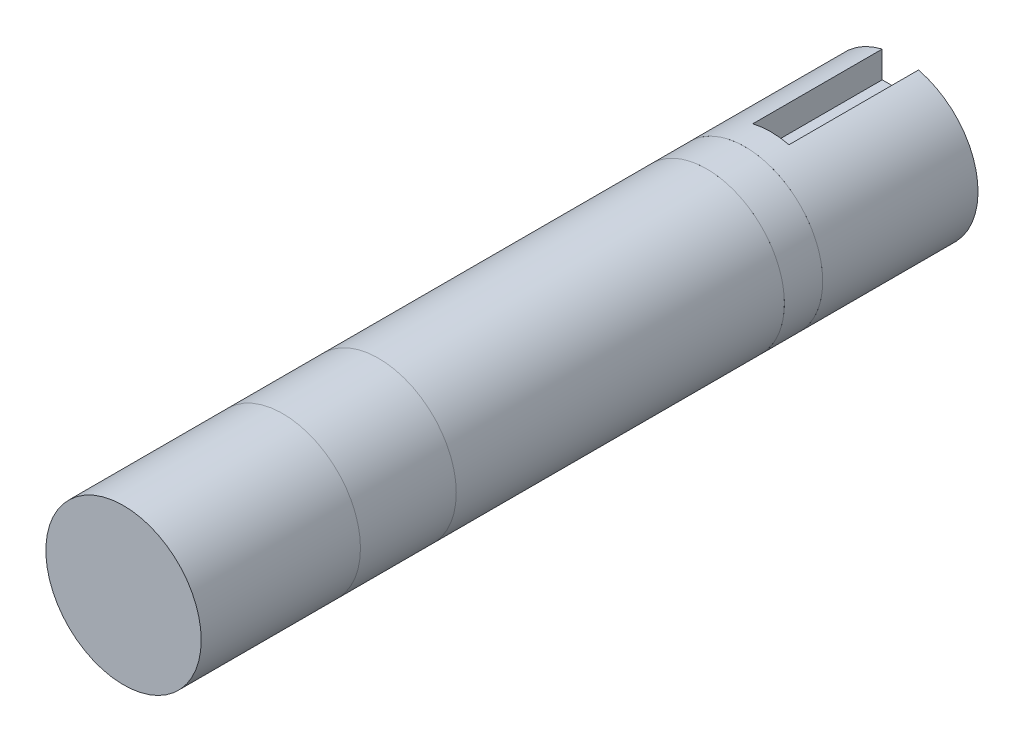
ISO-10303-21;
HEADER;
FILE_DESCRIPTION(('STEP AP214'),'2;1');
FILE_NAME('part.step','',(''),(''),'','','');
FILE_SCHEMA(('AUTOMOTIVE_DESIGN { 1 0 10303 214 1 1 1 1 }'));
ENDSEC;
DATA;
#1=APPLICATION_CONTEXT('core data for automotive mechanical design processes');
#2=APPLICATION_PROTOCOL_DEFINITION('international standard','automotive_design',2000,#1);
#3=PRODUCT_CONTEXT('',#1,'mechanical');
#4=PRODUCT('Part','Part','',(#3));
#5=PRODUCT_RELATED_PRODUCT_CATEGORY('part','',(#4));
#6=PRODUCT_DEFINITION_FORMATION('','',#4);
#7=PRODUCT_DEFINITION_CONTEXT('part definition',#1,'design');
#8=PRODUCT_DEFINITION('design','',#6,#7);
#9=PRODUCT_DEFINITION_SHAPE('','',#8);
#10=(LENGTH_UNIT() NAMED_UNIT(*) SI_UNIT(.MILLI.,.METRE.));
#11=(NAMED_UNIT(*) PLANE_ANGLE_UNIT() SI_UNIT($,.RADIAN.));
#12=(NAMED_UNIT(*) SI_UNIT($,.STERADIAN.) SOLID_ANGLE_UNIT());
#13=UNCERTAINTY_MEASURE_WITH_UNIT(LENGTH_MEASURE(1.E-05),#10,'distance_accuracy_value','');
#14=(GEOMETRIC_REPRESENTATION_CONTEXT(3) GLOBAL_UNCERTAINTY_ASSIGNED_CONTEXT((#13)) GLOBAL_UNIT_ASSIGNED_CONTEXT((#10,
#11,#12)) REPRESENTATION_CONTEXT('',''));
#15=CARTESIAN_POINT('',(0.,0.,0.));
#16=DIRECTION('',(0.,0.,1.));
#17=DIRECTION('',(1.,0.,0.));
#18=AXIS2_PLACEMENT_3D('',#15,#16,#17);
#19=CARTESIAN_POINT('',(0.,0.,-1500.));
#20=DIRECTION('',(0.,0.,1.));
#21=DIRECTION('',(1.,0.,0.));
#22=AXIS2_PLACEMENT_3D('',#19,#20,#21);
#23=CYLINDRICAL_SURFACE('',#22,150.);
#24=CARTESIAN_POINT('',(0.,0.,-492.5));
#25=DIRECTION('',(0.,0.,1.));
#26=DIRECTION('',(1.,0.,0.));
#27=AXIS2_PLACEMENT_3D('',#24,#25,#26);
#28=CIRCLE('',#27,150.);
#29=CARTESIAN_POINT('',(150.,0.,-492.5));
#30=VERTEX_POINT('',#29);
#31=EDGE_CURVE('E178',#30,#30,#28,.T.);
#32=ORIENTED_EDGE('',*,*,#31,.F.);
#33=EDGE_LOOP('',(#32));
#34=FACE_BOUND('',#33,.T.);
#35=CARTESIAN_POINT('',(0.,0.,-1126.));
#36=DIRECTION('',(0.,0.,-1.));
#37=DIRECTION('',(-1.,0.,0.));
#38=AXIS2_PLACEMENT_3D('',#35,#36,#37);
#39=CIRCLE('',#38,150.);
#40=CARTESIAN_POINT('',(-150.,0.,-1126.));
#41=VERTEX_POINT('',#40);
#42=EDGE_CURVE('E187',#41,#41,#39,.T.);
#43=ORIENTED_EDGE('',*,*,#42,.F.);
#44=EDGE_LOOP('',(#43));
#45=FACE_BOUND('',#44,.T.);
#46=ADVANCED_FACE('F52',(#34,#45),#23,.T.);
#47=CARTESIAN_POINT('',(0.,0.,-492.5));
#48=DIRECTION('',(0.,0.,1.));
#49=DIRECTION('',(1.,0.,0.));
#50=AXIS2_PLACEMENT_3D('',#47,#48,#49);
#51=CYLINDRICAL_SURFACE('',#50,150.0001);
#52=CARTESIAN_POINT('',(0.,0.,-492.5));
#53=DIRECTION('',(0.,0.,1.));
#54=DIRECTION('',(1.,0.,0.));
#55=AXIS2_PLACEMENT_3D('',#52,#53,#54);
#56=CIRCLE('',#55,150.0001);
#57=CARTESIAN_POINT('',(150.0001,0.,-492.5));
#58=VERTEX_POINT('',#57);
#59=EDGE_CURVE('E119',#58,#58,#56,.T.);
#60=ORIENTED_EDGE('',*,*,#59,.T.);
#61=EDGE_LOOP('',(#60));
#62=FACE_BOUND('',#61,.T.);
#63=CARTESIAN_POINT('',(0.,0.,-307.5));
#64=DIRECTION('',(0.,0.,1.));
#65=DIRECTION('',(1.,0.,0.));
#66=AXIS2_PLACEMENT_3D('',#63,#64,#65);
#67=CIRCLE('',#66,150.0001);
#68=CARTESIAN_POINT('',(150.0001,0.,-307.5));
#69=VERTEX_POINT('',#68);
#70=EDGE_CURVE('E175',#69,#69,#67,.T.);
#71=ORIENTED_EDGE('',*,*,#70,.F.);
#72=EDGE_LOOP('',(#71));
#73=FACE_BOUND('',#72,.T.);
#74=ADVANCED_FACE('F152',(#62,#73),#51,.T.);
#75=CARTESIAN_POINT('',(0.,0.,-492.5));
#76=DIRECTION('',(0.,0.,1.));
#77=DIRECTION('',(1.,0.,0.));
#78=AXIS2_PLACEMENT_3D('',#75,#76,#77);
#79=PLANE('',#78);
#80=ORIENTED_EDGE('',*,*,#31,.T.);
#81=EDGE_LOOP('',(#80));
#82=FACE_BOUND('',#81,.T.);
#83=ORIENTED_EDGE('',*,*,#59,.F.);
#84=EDGE_LOOP('',(#83));
#85=FACE_BOUND('',#84,.T.);
#86=ADVANCED_FACE('F148',(#82,#85),#79,.F.);
#87=CARTESIAN_POINT('',(0.,0.,-307.5));
#88=DIRECTION('',(0.,0.,1.));
#89=DIRECTION('',(1.,0.,0.));
#90=AXIS2_PLACEMENT_3D('',#87,#88,#89);
#91=PLANE('',#90);
#92=CARTESIAN_POINT('',(0.,0.,-307.5));
#93=DIRECTION('',(0.,0.,1.));
#94=DIRECTION('',(1.,0.,0.));
#95=AXIS2_PLACEMENT_3D('',#92,#93,#94);
#96=CIRCLE('',#95,150.);
#97=CARTESIAN_POINT('',(150.,0.,-307.5));
#98=VERTEX_POINT('',#97);
#99=EDGE_CURVE('E60',#98,#98,#96,.F.);
#100=ORIENTED_EDGE('',*,*,#99,.T.);
#101=EDGE_LOOP('',(#100));
#102=FACE_BOUND('',#101,.T.);
#103=ORIENTED_EDGE('',*,*,#70,.T.);
#104=EDGE_LOOP('',(#103));
#105=FACE_BOUND('',#104,.T.);
#106=ADVANCED_FACE('F134',(#102,#105),#91,.T.);
#107=CARTESIAN_POINT('',(0.,0.,0.));
#108=DIRECTION('',(0.,0.,1.));
#109=DIRECTION('',(1.,0.,0.));
#110=AXIS2_PLACEMENT_3D('',#107,#108,#109);
#111=PLANE('',#110);
#112=CARTESIAN_POINT('',(0.,0.,0.));
#113=DIRECTION('',(0.,0.,1.));
#114=DIRECTION('',(1.,0.,0.));
#115=AXIS2_PLACEMENT_3D('',#112,#113,#114);
#116=CIRCLE('',#115,150.);
#117=CARTESIAN_POINT('',(150.,0.,0.));
#118=VERTEX_POINT('',#117);
#119=EDGE_CURVE('E124',#118,#118,#116,.T.);
#120=ORIENTED_EDGE('',*,*,#119,.T.);
#121=EDGE_LOOP('',(#120));
#122=FACE_BOUND('',#121,.T.);
#123=ADVANCED_FACE('F140',(#122),#111,.T.);
#124=ORIENTED_EDGE('',*,*,#99,.F.);
#125=EDGE_LOOP('',(#124));
#126=FACE_BOUND('',#125,.T.);
#127=ORIENTED_EDGE('',*,*,#119,.F.);
#128=EDGE_LOOP('',(#127));
#129=FACE_BOUND('',#128,.T.);
#130=ADVANCED_FACE('F54',(#126,#129),#23,.T.);
#131=CARTESIAN_POINT('',(0.,0.,-1126.));
#132=DIRECTION('',(0.,0.,-1.));
#133=DIRECTION('',(-1.,0.,0.));
#134=AXIS2_PLACEMENT_3D('',#131,#132,#133);
#135=CYLINDRICAL_SURFACE('',#134,150.0001);
#136=CARTESIAN_POINT('',(0.,0.,-1126.));
#137=DIRECTION('',(0.,0.,-1.));
#138=DIRECTION('',(-1.,0.,0.));
#139=AXIS2_PLACEMENT_3D('',#136,#137,#138);
#140=CIRCLE('',#139,150.0001);
#141=CARTESIAN_POINT('',(-150.0001,0.,-1126.));
#142=VERTEX_POINT('',#141);
#143=EDGE_CURVE('E183',#142,#142,#140,.T.);
#144=ORIENTED_EDGE('',*,*,#143,.T.);
#145=EDGE_LOOP('',(#144));
#146=FACE_BOUND('',#145,.T.);
#147=CARTESIAN_POINT('',(0.,0.,-1200.));
#148=DIRECTION('',(0.,0.,-1.));
#149=DIRECTION('',(-1.,0.,0.));
#150=AXIS2_PLACEMENT_3D('',#147,#148,#149);
#151=CIRCLE('',#150,150.0001);
#152=CARTESIAN_POINT('',(-150.0001,0.,-1200.));
#153=VERTEX_POINT('',#152);
#154=EDGE_CURVE('E184',#153,#153,#151,.T.);
#155=ORIENTED_EDGE('',*,*,#154,.F.);
#156=EDGE_LOOP('',(#155));
#157=FACE_BOUND('',#156,.T.);
#158=ADVANCED_FACE('F139',(#146,#157),#135,.T.);
#159=CARTESIAN_POINT('',(0.,0.,-1126.));
#160=DIRECTION('',(0.,0.,-1.));
#161=DIRECTION('',(-1.,0.,0.));
#162=AXIS2_PLACEMENT_3D('',#159,#160,#161);
#163=PLANE('',#162);
#164=ORIENTED_EDGE('',*,*,#42,.T.);
#165=EDGE_LOOP('',(#164));
#166=FACE_BOUND('',#165,.T.);
#167=ORIENTED_EDGE('',*,*,#143,.F.);
#168=EDGE_LOOP('',(#167));
#169=FACE_BOUND('',#168,.T.);
#170=ADVANCED_FACE('F193',(#166,#169),#163,.F.);
#171=CARTESIAN_POINT('',(0.,0.,-1200.));
#172=DIRECTION('',(0.,0.,-1.));
#173=DIRECTION('',(-1.,0.,0.));
#174=AXIS2_PLACEMENT_3D('',#171,#172,#173);
#175=PLANE('',#174);
#176=CARTESIAN_POINT('',(0.,0.,-1200.));
#177=DIRECTION('',(0.,0.,-1.));
#178=DIRECTION('',(-1.,0.,0.));
#179=AXIS2_PLACEMENT_3D('',#176,#177,#178);
#180=CIRCLE('',#179,150.);
#181=CARTESIAN_POINT('',(-150.,0.,-1200.));
#182=VERTEX_POINT('',#181);
#183=EDGE_CURVE('E13',#182,#182,#180,.F.);
#184=ORIENTED_EDGE('',*,*,#183,.T.);
#185=EDGE_LOOP('',(#184));
#186=FACE_BOUND('',#185,.T.);
#187=ORIENTED_EDGE('',*,*,#154,.T.);
#188=EDGE_LOOP('',(#187));
#189=FACE_BOUND('',#188,.T.);
#190=ADVANCED_FACE('F196',(#186,#189),#175,.T.);
#191=CARTESIAN_POINT('',(35.,94.4,-1250.));
#192=DIRECTION('',(0.,-1.,0.));
#193=DIRECTION('',(0.,0.,-1.));
#194=AXIS2_PLACEMENT_3D('',#191,#192,#193);
#195=PLANE('',#194);
#196=DIRECTION('',(-1.,0.,0.));
#197=VECTOR('',#196,1.);
#198=CARTESIAN_POINT('',(35.,94.4,-1500.));
#199=LINE('',#198,#197);
#200=CARTESIAN_POINT('',(35.,94.4,-1500.));
#201=VERTEX_POINT('',#200);
#202=CARTESIAN_POINT('',(-35.,94.4,-1500.));
#203=VERTEX_POINT('',#202);
#204=EDGE_CURVE('E118',#201,#203,#199,.T.);
#205=ORIENTED_EDGE('',*,*,#204,.T.);
#206=DIRECTION('',(0.,0.,-1.));
#207=VECTOR('',#206,1.);
#208=CARTESIAN_POINT('',(-35.,94.4,-1250.));
#209=LINE('',#208,#207);
#210=CARTESIAN_POINT('',(-35.,94.4,-1250.));
#211=VERTEX_POINT('',#210);
#212=EDGE_CURVE('E110',#211,#203,#209,.T.);
#213=ORIENTED_EDGE('',*,*,#212,.F.);
#214=DIRECTION('',(-1.,0.,0.));
#215=VECTOR('',#214,1.);
#216=CARTESIAN_POINT('',(35.,94.4,-1250.));
#217=LINE('',#216,#215);
#218=CARTESIAN_POINT('',(35.,94.4,-1250.));
#219=VERTEX_POINT('',#218);
#220=EDGE_CURVE('E98',#219,#211,#217,.T.);
#221=ORIENTED_EDGE('',*,*,#220,.F.);
#222=DIRECTION('',(0.,0.,-1.));
#223=VECTOR('',#222,1.);
#224=CARTESIAN_POINT('',(35.,94.4,-1250.));
#225=LINE('',#224,#223);
#226=EDGE_CURVE('E104',#219,#201,#225,.T.);
#227=ORIENTED_EDGE('',*,*,#226,.T.);
#228=EDGE_LOOP('',(#205,#213,#221,#227));
#229=FACE_BOUND('',#228,.T.);
#230=ADVANCED_FACE('F112',(#229),#195,.F.);
#231=CARTESIAN_POINT('',(0.,0.,-1250.));
#232=DIRECTION('',(0.,0.,1.));
#233=DIRECTION('',(1.,0.,0.));
#234=AXIS2_PLACEMENT_3D('',#231,#232,#233);
#235=PLANE('',#234);
#236=CARTESIAN_POINT('',(0.,0.,-1250.));
#237=DIRECTION('',(0.,0.,1.));
#238=DIRECTION('',(1.,0.,0.));
#239=AXIS2_PLACEMENT_3D('',#236,#237,#238);
#240=CIRCLE('',#239,150.);
#241=CARTESIAN_POINT('',(-35.,145.859521458148,-1250.));
#242=VERTEX_POINT('',#241);
#243=CARTESIAN_POINT('',(35.,145.859521458148,-1250.));
#244=VERTEX_POINT('',#243);
#245=EDGE_CURVE('E100',#242,#244,#240,.F.);
#246=ORIENTED_EDGE('',*,*,#245,.T.);
#247=DIRECTION('',(0.,-1.,0.));
#248=VECTOR('',#247,1.);
#249=CARTESIAN_POINT('',(35.,94.4,-1250.));
#250=LINE('',#249,#248);
#251=EDGE_CURVE('E94',#244,#219,#250,.T.);
#252=ORIENTED_EDGE('',*,*,#251,.T.);
#253=ORIENTED_EDGE('',*,*,#220,.T.);
#254=DIRECTION('',(0.,1.,0.));
#255=VECTOR('',#254,1.);
#256=CARTESIAN_POINT('',(-35.,94.4,-1250.));
#257=LINE('',#256,#255);
#258=EDGE_CURVE('E101',#211,#242,#257,.T.);
#259=ORIENTED_EDGE('',*,*,#258,.T.);
#260=EDGE_LOOP('',(#246,#252,#253,#259));
#261=FACE_BOUND('',#260,.T.);
#262=ADVANCED_FACE('F96',(#261),#235,.F.);
#263=CARTESIAN_POINT('',(35.,94.4,-1250.));
#264=DIRECTION('',(1.,0.,0.));
#265=DIRECTION('',(0.,0.,-1.));
#266=AXIS2_PLACEMENT_3D('',#263,#264,#265);
#267=PLANE('',#266);
#268=DIRECTION('',(0.,0.,1.));
#269=VECTOR('',#268,1.);
#270=CARTESIAN_POINT('',(35.,145.859521458148,-1500.));
#271=LINE('',#270,#269);
#272=CARTESIAN_POINT('',(35.,145.859521458148,-1500.));
#273=VERTEX_POINT('',#272);
#274=EDGE_CURVE('E67',#244,#273,#271,.F.);
#275=ORIENTED_EDGE('',*,*,#274,.T.);
#276=DIRECTION('',(0.,1.,0.));
#277=VECTOR('',#276,1.);
#278=CARTESIAN_POINT('',(35.,0.,-1500.));
#279=LINE('',#278,#277);
#280=EDGE_CURVE('E106',#201,#273,#279,.T.);
#281=ORIENTED_EDGE('',*,*,#280,.F.);
#282=ORIENTED_EDGE('',*,*,#226,.F.);
#283=ORIENTED_EDGE('',*,*,#251,.F.);
#284=EDGE_LOOP('',(#275,#281,#282,#283));
#285=FACE_BOUND('',#284,.T.);
#286=ADVANCED_FACE('F105',(#285),#267,.F.);
#287=CARTESIAN_POINT('',(0.,0.,-1500.));
#288=DIRECTION('',(0.,0.,1.));
#289=DIRECTION('',(1.,0.,0.));
#290=AXIS2_PLACEMENT_3D('',#287,#288,#289);
#291=PLANE('',#290);
#292=CARTESIAN_POINT('',(0.,0.,-1500.));
#293=DIRECTION('',(0.,0.,1.));
#294=DIRECTION('',(1.,0.,0.));
#295=AXIS2_PLACEMENT_3D('',#292,#293,#294);
#296=CIRCLE('',#295,150.);
#297=CARTESIAN_POINT('',(-35.,145.859521458148,-1500.));
#298=VERTEX_POINT('',#297);
#299=EDGE_CURVE('E125',#298,#273,#296,.T.);
#300=ORIENTED_EDGE('',*,*,#299,.F.);
#301=DIRECTION('',(0.,1.,0.));
#302=VECTOR('',#301,1.);
#303=CARTESIAN_POINT('',(-35.,94.4,-1500.));
#304=LINE('',#303,#302);
#305=EDGE_CURVE('E115',#203,#298,#304,.T.);
#306=ORIENTED_EDGE('',*,*,#305,.F.);
#307=ORIENTED_EDGE('',*,*,#204,.F.);
#308=ORIENTED_EDGE('',*,*,#280,.T.);
#309=EDGE_LOOP('',(#300,#306,#307,#308));
#310=FACE_BOUND('',#309,.T.);
#311=ADVANCED_FACE('F167',(#310),#291,.F.);
#312=CARTESIAN_POINT('',(-35.,94.4,-1250.));
#313=DIRECTION('',(-1.,0.,0.));
#314=DIRECTION('',(0.,0.,1.));
#315=AXIS2_PLACEMENT_3D('',#312,#313,#314);
#316=PLANE('',#315);
#317=DIRECTION('',(0.,0.,1.));
#318=VECTOR('',#317,1.);
#319=CARTESIAN_POINT('',(-35.,145.859521458148,-1500.));
#320=LINE('',#319,#318);
#321=EDGE_CURVE('E75',#298,#242,#320,.T.);
#322=ORIENTED_EDGE('',*,*,#321,.T.);
#323=ORIENTED_EDGE('',*,*,#258,.F.);
#324=ORIENTED_EDGE('',*,*,#212,.T.);
#325=ORIENTED_EDGE('',*,*,#305,.T.);
#326=EDGE_LOOP('',(#322,#323,#324,#325));
#327=FACE_BOUND('',#326,.T.);
#328=ADVANCED_FACE('F162',(#327),#316,.F.);
#329=ORIENTED_EDGE('',*,*,#183,.F.);
#330=EDGE_LOOP('',(#329));
#331=FACE_BOUND('',#330,.T.);
#332=ORIENTED_EDGE('',*,*,#321,.F.);
#333=ORIENTED_EDGE('',*,*,#299,.T.);
#334=ORIENTED_EDGE('',*,*,#274,.F.);
#335=ORIENTED_EDGE('',*,*,#245,.F.);
#336=EDGE_LOOP('',(#332,#333,#334,#335));
#337=FACE_BOUND('',#336,.T.);
#338=ADVANCED_FACE('F141',(#331,#337),#23,.T.);
#339=CLOSED_SHELL('',(#46,#74,#86,#106,#123,#130,#158,#170,#190,#230,#262,#286,#311,#328,#338));
#340=MANIFOLD_SOLID_BREP('B2',#339);
#341=ADVANCED_BREP_SHAPE_REPRESENTATION('',(#18,#340),#14);
#342=SHAPE_DEFINITION_REPRESENTATION(#9,#341);
ENDSEC;
END-ISO-10303-21;
